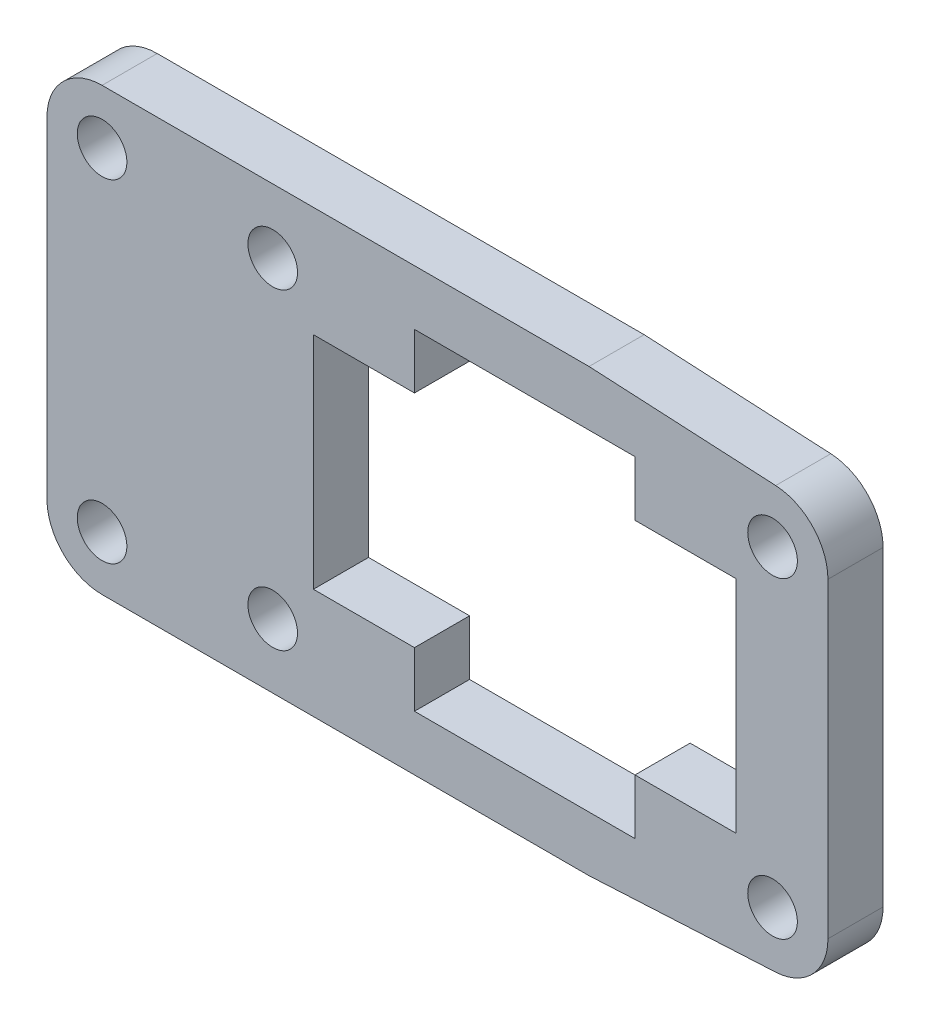
ISO-10303-21;
HEADER;
FILE_DESCRIPTION(('STEP AP214'),'2;1');
FILE_NAME('part.step','',(''),(''),'','','');
FILE_SCHEMA(('AUTOMOTIVE_DESIGN { 1 0 10303 214 1 1 1 1 }'));
ENDSEC;
DATA;
#1=APPLICATION_CONTEXT('core data for automotive mechanical design processes');
#2=APPLICATION_PROTOCOL_DEFINITION('international standard','automotive_design',2000,#1);
#3=PRODUCT_CONTEXT('',#1,'mechanical');
#4=PRODUCT('Part','Part','',(#3));
#5=PRODUCT_RELATED_PRODUCT_CATEGORY('part','',(#4));
#6=PRODUCT_DEFINITION_FORMATION('','',#4);
#7=PRODUCT_DEFINITION_CONTEXT('part definition',#1,'design');
#8=PRODUCT_DEFINITION('design','',#6,#7);
#9=PRODUCT_DEFINITION_SHAPE('','',#8);
#10=(LENGTH_UNIT() NAMED_UNIT(*) SI_UNIT(.MILLI.,.METRE.));
#11=(NAMED_UNIT(*) PLANE_ANGLE_UNIT() SI_UNIT($,.RADIAN.));
#12=(NAMED_UNIT(*) SI_UNIT($,.STERADIAN.) SOLID_ANGLE_UNIT());
#13=UNCERTAINTY_MEASURE_WITH_UNIT(LENGTH_MEASURE(1.E-05),#10,'distance_accuracy_value','');
#14=(GEOMETRIC_REPRESENTATION_CONTEXT(3) GLOBAL_UNCERTAINTY_ASSIGNED_CONTEXT((#13)) GLOBAL_UNIT_ASSIGNED_CONTEXT((#10,
#11,#12)) REPRESENTATION_CONTEXT('',''));
#15=CARTESIAN_POINT('',(0.,0.,0.));
#16=DIRECTION('',(0.,0.,1.));
#17=DIRECTION('',(1.,0.,0.));
#18=AXIS2_PLACEMENT_3D('',#15,#16,#17);
#19=CARTESIAN_POINT('',(-12.6573181561229,20.9998,0.));
#20=DIRECTION('',(0.,0.,1.));
#21=DIRECTION('',(1.,0.,0.));
#22=AXIS2_PLACEMENT_3D('',#19,#20,#21);
#23=CYLINDRICAL_SURFACE('',#22,2.99999999999999);
#24=CARTESIAN_POINT('',(-12.6573181561229,20.9998,3.));
#25=DIRECTION('',(0.,0.,1.));
#26=DIRECTION('',(1.,0.,0.));
#27=AXIS2_PLACEMENT_3D('',#24,#25,#26);
#28=CIRCLE('',#27,2.99999999999999);
#29=CARTESIAN_POINT('',(-12.6573181561229,23.9998,3.));
#30=VERTEX_POINT('',#29);
#31=CARTESIAN_POINT('',(-15.6573181561229,20.9998,3.));
#32=VERTEX_POINT('',#31);
#33=EDGE_CURVE('E319',#30,#32,#28,.T.);
#34=ORIENTED_EDGE('',*,*,#33,.F.);
#35=DIRECTION('',(0.,0.,1.));
#36=VECTOR('',#35,1.);
#37=CARTESIAN_POINT('',(-12.6573181561229,23.9998,0.));
#38=LINE('',#37,#36);
#39=CARTESIAN_POINT('',(-12.6573181561229,23.9998,0.));
#40=VERTEX_POINT('',#39);
#41=EDGE_CURVE('E11',#40,#30,#38,.T.);
#42=ORIENTED_EDGE('',*,*,#41,.F.);
#43=CARTESIAN_POINT('',(-12.6573181561229,20.9998,0.));
#44=DIRECTION('',(0.,0.,1.));
#45=DIRECTION('',(1.,0.,0.));
#46=AXIS2_PLACEMENT_3D('',#43,#44,#45);
#47=CIRCLE('',#46,2.99999999999999);
#48=CARTESIAN_POINT('',(-15.6573181561229,20.9998,0.));
#49=VERTEX_POINT('',#48);
#50=EDGE_CURVE('E322',#40,#49,#47,.T.);
#51=ORIENTED_EDGE('',*,*,#50,.T.);
#52=DIRECTION('',(0.,0.,1.));
#53=VECTOR('',#52,1.);
#54=CARTESIAN_POINT('',(-15.6573181561229,20.9998,0.));
#55=LINE('',#54,#53);
#56=EDGE_CURVE('E39',#49,#32,#55,.T.);
#57=ORIENTED_EDGE('',*,*,#56,.T.);
#58=EDGE_LOOP('',(#34,#42,#51,#57));
#59=FACE_BOUND('',#58,.T.);
#60=ADVANCED_FACE('F36',(#59),#23,.T.);
#61=CARTESIAN_POINT('',(13.8436818438771,23.9998,0.));
#62=DIRECTION('',(0.,1.,0.));
#63=DIRECTION('',(0.,0.,1.));
#64=AXIS2_PLACEMENT_3D('',#61,#62,#63);
#65=PLANE('',#64);
#66=DIRECTION('',(-1.,0.,0.));
#67=VECTOR('',#66,1.);
#68=CARTESIAN_POINT('',(13.8436818438771,23.9998,3.));
#69=LINE('',#68,#67);
#70=CARTESIAN_POINT('',(13.8436818438771,23.9998,3.));
#71=VERTEX_POINT('',#70);
#72=EDGE_CURVE('E326',#71,#30,#69,.T.);
#73=ORIENTED_EDGE('',*,*,#72,.F.);
#74=DIRECTION('',(0.,0.,1.));
#75=VECTOR('',#74,1.);
#76=CARTESIAN_POINT('',(13.8436818438771,23.9998,0.));
#77=LINE('',#76,#75);
#78=CARTESIAN_POINT('',(13.8436818438771,23.9998,0.));
#79=VERTEX_POINT('',#78);
#80=EDGE_CURVE('E44',#79,#71,#77,.T.);
#81=ORIENTED_EDGE('',*,*,#80,.F.);
#82=DIRECTION('',(-1.,0.,0.));
#83=VECTOR('',#82,1.);
#84=CARTESIAN_POINT('',(13.8436818438771,23.9998,0.));
#85=LINE('',#84,#83);
#86=EDGE_CURVE('E350',#79,#40,#85,.T.);
#87=ORIENTED_EDGE('',*,*,#86,.T.);
#88=ORIENTED_EDGE('',*,*,#41,.T.);
#89=EDGE_LOOP('',(#73,#81,#87,#88));
#90=FACE_BOUND('',#89,.T.);
#91=ADVANCED_FACE('F407',(#90),#65,.T.);
#92=CARTESIAN_POINT('',(24.0010920540107,23.4678047027526,0.));
#93=DIRECTION('',(0.0523034033778749,0.998631240245913,0.));
#94=DIRECTION('',(-0.998631240245914,0.0523034033778749,0.));
#95=AXIS2_PLACEMENT_3D('',#92,#93,#94);
#96=PLANE('',#95);
#97=DIRECTION('',(-0.998631240245914,0.0523034033778749,0.));
#98=VECTOR('',#97,1.);
#99=CARTESIAN_POINT('',(24.0010920540107,23.4678047027526,3.));
#100=LINE('',#99,#98);
#101=CARTESIAN_POINT('',(24.0010920540107,23.4678047027526,3.));
#102=VERTEX_POINT('',#101);
#103=EDGE_CURVE('E376',#102,#71,#100,.T.);
#104=ORIENTED_EDGE('',*,*,#103,.F.);
#105=DIRECTION('',(0.,0.,1.));
#106=VECTOR('',#105,1.);
#107=CARTESIAN_POINT('',(24.0010920540107,23.4678047027526,0.));
#108=LINE('',#107,#106);
#109=CARTESIAN_POINT('',(24.0010920540107,23.4678047027526,0.));
#110=VERTEX_POINT('',#109);
#111=EDGE_CURVE('E382',#110,#102,#108,.T.);
#112=ORIENTED_EDGE('',*,*,#111,.F.);
#113=DIRECTION('',(-0.998631240245914,0.0523034033778749,0.));
#114=VECTOR('',#113,1.);
#115=CARTESIAN_POINT('',(24.0010920540107,23.4678047027526,0.));
#116=LINE('',#115,#114);
#117=EDGE_CURVE('E347',#110,#79,#116,.T.);
#118=ORIENTED_EDGE('',*,*,#117,.T.);
#119=ORIENTED_EDGE('',*,*,#80,.T.);
#120=EDGE_LOOP('',(#104,#112,#118,#119));
#121=FACE_BOUND('',#120,.T.);
#122=ADVANCED_FACE('F435',(#121),#96,.T.);
#123=CARTESIAN_POINT('',(23.844181843877,20.4719109820149,0.));
#124=DIRECTION('',(0.,0.,1.));
#125=DIRECTION('',(1.,0.,0.));
#126=AXIS2_PLACEMENT_3D('',#123,#124,#125);
#127=CYLINDRICAL_SURFACE('',#126,3.00000000000001);
#128=CARTESIAN_POINT('',(23.844181843877,20.4719109820149,3.));
#129=DIRECTION('',(0.,0.,1.));
#130=DIRECTION('',(1.,0.,0.));
#131=AXIS2_PLACEMENT_3D('',#128,#129,#130);
#132=CIRCLE('',#131,3.00000000000001);
#133=CARTESIAN_POINT('',(26.844181843877,20.4719109820149,3.));
#134=VERTEX_POINT('',#133);
#135=EDGE_CURVE('E373',#134,#102,#132,.T.);
#136=ORIENTED_EDGE('',*,*,#135,.F.);
#137=DIRECTION('',(0.,0.,1.));
#138=VECTOR('',#137,1.);
#139=CARTESIAN_POINT('',(26.844181843877,20.4719109820149,0.));
#140=LINE('',#139,#138);
#141=CARTESIAN_POINT('',(26.844181843877,20.4719109820149,0.));
#142=VERTEX_POINT('',#141);
#143=EDGE_CURVE('E384',#142,#134,#140,.T.);
#144=ORIENTED_EDGE('',*,*,#143,.F.);
#145=CARTESIAN_POINT('',(23.844181843877,20.4719109820149,0.));
#146=DIRECTION('',(0.,0.,1.));
#147=DIRECTION('',(1.,0.,0.));
#148=AXIS2_PLACEMENT_3D('',#145,#146,#147);
#149=CIRCLE('',#148,3.00000000000001);
#150=EDGE_CURVE('E344',#142,#110,#149,.T.);
#151=ORIENTED_EDGE('',*,*,#150,.T.);
#152=ORIENTED_EDGE('',*,*,#111,.T.);
#153=EDGE_LOOP('',(#136,#144,#151,#152));
#154=FACE_BOUND('',#153,.T.);
#155=ADVANCED_FACE('F433',(#154),#127,.T.);
#156=CARTESIAN_POINT('',(26.844181843877,3.52888902362418,0.));
#157=DIRECTION('',(1.,0.,0.));
#158=DIRECTION('',(0.,0.,-1.));
#159=AXIS2_PLACEMENT_3D('',#156,#157,#158);
#160=PLANE('',#159);
#161=DIRECTION('',(0.,1.,0.));
#162=VECTOR('',#161,1.);
#163=CARTESIAN_POINT('',(26.844181843877,3.52888902362418,3.));
#164=LINE('',#163,#162);
#165=CARTESIAN_POINT('',(26.844181843877,3.52888902362418,3.));
#166=VERTEX_POINT('',#165);
#167=EDGE_CURVE('E370',#166,#134,#164,.T.);
#168=ORIENTED_EDGE('',*,*,#167,.F.);
#169=DIRECTION('',(0.,0.,1.));
#170=VECTOR('',#169,1.);
#171=CARTESIAN_POINT('',(26.844181843877,3.52888902362418,0.));
#172=LINE('',#171,#170);
#173=CARTESIAN_POINT('',(26.844181843877,3.52888902362418,0.));
#174=VERTEX_POINT('',#173);
#175=EDGE_CURVE('E386',#174,#166,#172,.T.);
#176=ORIENTED_EDGE('',*,*,#175,.F.);
#177=DIRECTION('',(0.,1.,0.));
#178=VECTOR('',#177,1.);
#179=CARTESIAN_POINT('',(26.844181843877,3.52888902362418,0.));
#180=LINE('',#179,#178);
#181=EDGE_CURVE('E341',#174,#142,#180,.T.);
#182=ORIENTED_EDGE('',*,*,#181,.T.);
#183=ORIENTED_EDGE('',*,*,#143,.T.);
#184=EDGE_LOOP('',(#168,#176,#182,#183));
#185=FACE_BOUND('',#184,.T.);
#186=ADVANCED_FACE('F429',(#185),#160,.T.);
#187=CARTESIAN_POINT('',(23.844181843877,3.52888902362418,0.));
#188=DIRECTION('',(0.,0.,1.));
#189=DIRECTION('',(1.,0.,0.));
#190=AXIS2_PLACEMENT_3D('',#187,#188,#189);
#191=CYLINDRICAL_SURFACE('',#190,3.);
#192=CARTESIAN_POINT('',(23.844181843877,3.52888902362418,3.));
#193=DIRECTION('',(0.,0.,1.));
#194=DIRECTION('',(1.,0.,0.));
#195=AXIS2_PLACEMENT_3D('',#192,#193,#194);
#196=CIRCLE('',#195,3.);
#197=CARTESIAN_POINT('',(24.0013861888822,0.533010722706152,3.));
#198=VERTEX_POINT('',#197);
#199=EDGE_CURVE('E367',#198,#166,#196,.T.);
#200=ORIENTED_EDGE('',*,*,#199,.F.);
#201=DIRECTION('',(0.,0.,1.));
#202=VECTOR('',#201,1.);
#203=CARTESIAN_POINT('',(24.0013861888822,0.533010722706152,0.));
#204=LINE('',#203,#202);
#205=CARTESIAN_POINT('',(24.0013861888822,0.533010722706152,0.));
#206=VERTEX_POINT('',#205);
#207=EDGE_CURVE('E388',#206,#198,#204,.T.);
#208=ORIENTED_EDGE('',*,*,#207,.F.);
#209=CARTESIAN_POINT('',(23.844181843877,3.52888902362418,0.));
#210=DIRECTION('',(0.,0.,1.));
#211=DIRECTION('',(1.,0.,0.));
#212=AXIS2_PLACEMENT_3D('',#209,#210,#211);
#213=CIRCLE('',#212,3.);
#214=EDGE_CURVE('E338',#206,#174,#213,.T.);
#215=ORIENTED_EDGE('',*,*,#214,.T.);
#216=ORIENTED_EDGE('',*,*,#175,.T.);
#217=EDGE_LOOP('',(#200,#208,#215,#216));
#218=FACE_BOUND('',#217,.T.);
#219=ADVANCED_FACE('F425',(#218),#191,.T.);
#220=CARTESIAN_POINT('',(13.8436818438771,0.,0.));
#221=DIRECTION('',(0.0524014483350333,-0.998626100306011,0.));
#222=DIRECTION('',(0.998626100306011,0.0524014483350333,0.));
#223=AXIS2_PLACEMENT_3D('',#220,#221,#222);
#224=PLANE('',#223);
#225=DIRECTION('',(0.998626100306011,0.0524014483350333,0.));
#226=VECTOR('',#225,1.);
#227=CARTESIAN_POINT('',(13.8436818438771,0.,3.));
#228=LINE('',#227,#226);
#229=CARTESIAN_POINT('',(13.8436818438771,0.,3.));
#230=VERTEX_POINT('',#229);
#231=EDGE_CURVE('E364',#230,#198,#228,.T.);
#232=ORIENTED_EDGE('',*,*,#231,.F.);
#233=DIRECTION('',(0.,0.,1.));
#234=VECTOR('',#233,1.);
#235=CARTESIAN_POINT('',(13.8436818438771,0.,0.));
#236=LINE('',#235,#234);
#237=CARTESIAN_POINT('',(13.8436818438771,0.,0.));
#238=VERTEX_POINT('',#237);
#239=EDGE_CURVE('E390',#238,#230,#236,.T.);
#240=ORIENTED_EDGE('',*,*,#239,.F.);
#241=DIRECTION('',(0.998626100306011,0.0524014483350333,0.));
#242=VECTOR('',#241,1.);
#243=CARTESIAN_POINT('',(13.8436818438771,0.,0.));
#244=LINE('',#243,#242);
#245=EDGE_CURVE('E335',#238,#206,#244,.T.);
#246=ORIENTED_EDGE('',*,*,#245,.T.);
#247=ORIENTED_EDGE('',*,*,#207,.T.);
#248=EDGE_LOOP('',(#232,#240,#246,#247));
#249=FACE_BOUND('',#248,.T.);
#250=ADVANCED_FACE('F421',(#249),#224,.T.);
#251=CARTESIAN_POINT('',(-12.6573181561229,0.,0.));
#252=DIRECTION('',(0.,-1.,0.));
#253=DIRECTION('',(1.,0.,0.));
#254=AXIS2_PLACEMENT_3D('',#251,#252,#253);
#255=PLANE('',#254);
#256=DIRECTION('',(1.,0.,0.));
#257=VECTOR('',#256,1.);
#258=CARTESIAN_POINT('',(-12.6573181561229,0.,3.));
#259=LINE('',#258,#257);
#260=CARTESIAN_POINT('',(-12.6573181561229,0.,3.));
#261=VERTEX_POINT('',#260);
#262=EDGE_CURVE('E361',#261,#230,#259,.T.);
#263=ORIENTED_EDGE('',*,*,#262,.F.);
#264=DIRECTION('',(0.,0.,1.));
#265=VECTOR('',#264,1.);
#266=CARTESIAN_POINT('',(-12.6573181561229,0.,0.));
#267=LINE('',#266,#265);
#268=CARTESIAN_POINT('',(-12.6573181561229,0.,0.));
#269=VERTEX_POINT('',#268);
#270=EDGE_CURVE('E392',#269,#261,#267,.T.);
#271=ORIENTED_EDGE('',*,*,#270,.F.);
#272=DIRECTION('',(1.,0.,0.));
#273=VECTOR('',#272,1.);
#274=CARTESIAN_POINT('',(-12.6573181561229,0.,0.));
#275=LINE('',#274,#273);
#276=EDGE_CURVE('E332',#269,#238,#275,.T.);
#277=ORIENTED_EDGE('',*,*,#276,.T.);
#278=ORIENTED_EDGE('',*,*,#239,.T.);
#279=EDGE_LOOP('',(#263,#271,#277,#278));
#280=FACE_BOUND('',#279,.T.);
#281=ADVANCED_FACE('F419',(#280),#255,.T.);
#282=CARTESIAN_POINT('',(-12.6573181561229,3.,0.));
#283=DIRECTION('',(0.,0.,1.));
#284=DIRECTION('',(1.,0.,0.));
#285=AXIS2_PLACEMENT_3D('',#282,#283,#284);
#286=CYLINDRICAL_SURFACE('',#285,2.99999999999999);
#287=CARTESIAN_POINT('',(-12.6573181561229,3.,3.));
#288=DIRECTION('',(0.,0.,1.));
#289=DIRECTION('',(1.,0.,0.));
#290=AXIS2_PLACEMENT_3D('',#287,#288,#289);
#291=CIRCLE('',#290,2.99999999999999);
#292=CARTESIAN_POINT('',(-15.6573181561229,3.,3.));
#293=VERTEX_POINT('',#292);
#294=EDGE_CURVE('E358',#293,#261,#291,.T.);
#295=ORIENTED_EDGE('',*,*,#294,.F.);
#296=DIRECTION('',(0.,0.,1.));
#297=VECTOR('',#296,1.);
#298=CARTESIAN_POINT('',(-15.6573181561229,3.,0.));
#299=LINE('',#298,#297);
#300=CARTESIAN_POINT('',(-15.6573181561229,3.,0.));
#301=VERTEX_POINT('',#300);
#302=EDGE_CURVE('E393',#301,#293,#299,.T.);
#303=ORIENTED_EDGE('',*,*,#302,.F.);
#304=CARTESIAN_POINT('',(-12.6573181561229,3.,0.));
#305=DIRECTION('',(0.,0.,1.));
#306=DIRECTION('',(1.,0.,0.));
#307=AXIS2_PLACEMENT_3D('',#304,#305,#306);
#308=CIRCLE('',#307,2.99999999999999);
#309=EDGE_CURVE('E329',#301,#269,#308,.T.);
#310=ORIENTED_EDGE('',*,*,#309,.T.);
#311=ORIENTED_EDGE('',*,*,#270,.T.);
#312=EDGE_LOOP('',(#295,#303,#310,#311));
#313=FACE_BOUND('',#312,.T.);
#314=ADVANCED_FACE('F415',(#313),#286,.T.);
#315=CARTESIAN_POINT('',(-15.6573181561229,20.9998,0.));
#316=DIRECTION('',(-1.,0.,0.));
#317=DIRECTION('',(0.,0.,1.));
#318=AXIS2_PLACEMENT_3D('',#315,#316,#317);
#319=PLANE('',#318);
#320=DIRECTION('',(0.,-1.,0.));
#321=VECTOR('',#320,1.);
#322=CARTESIAN_POINT('',(-15.6573181561229,20.9998,3.));
#323=LINE('',#322,#321);
#324=EDGE_CURVE('E355',#32,#293,#323,.T.);
#325=ORIENTED_EDGE('',*,*,#324,.F.);
#326=ORIENTED_EDGE('',*,*,#56,.F.);
#327=DIRECTION('',(0.,-1.,0.));
#328=VECTOR('',#327,1.);
#329=CARTESIAN_POINT('',(-15.6573181561229,20.9998,0.));
#330=LINE('',#329,#328);
#331=EDGE_CURVE('E325',#49,#301,#330,.T.);
#332=ORIENTED_EDGE('',*,*,#331,.T.);
#333=ORIENTED_EDGE('',*,*,#302,.T.);
#334=EDGE_LOOP('',(#325,#326,#332,#333));
#335=FACE_BOUND('',#334,.T.);
#336=ADVANCED_FACE('F401',(#335),#319,.T.);
#337=CARTESIAN_POINT('',(-12.6573181561229,20.9998,0.));
#338=DIRECTION('',(0.,0.,1.));
#339=DIRECTION('',(1.,0.,0.));
#340=AXIS2_PLACEMENT_3D('',#337,#338,#339);
#341=PLANE('',#340);
#342=DIRECTION('',(0.,-1.,0.));
#343=VECTOR('',#342,1.);
#344=CARTESIAN_POINT('',(4.34338184387702,17.9998,0.));
#345=LINE('',#344,#343);
#346=CARTESIAN_POINT('',(4.34338184387702,20.9998,0.));
#347=VERTEX_POINT('',#346);
#348=CARTESIAN_POINT('',(4.34338184387702,17.9998,0.));
#349=VERTEX_POINT('',#348);
#350=EDGE_CURVE('E193',#347,#349,#345,.T.);
#351=ORIENTED_EDGE('',*,*,#350,.T.);
#352=DIRECTION('',(-1.,0.,0.));
#353=VECTOR('',#352,1.);
#354=CARTESIAN_POINT('',(-1.15651815612298,17.9998,0.));
#355=LINE('',#354,#353);
#356=CARTESIAN_POINT('',(-1.15651815612298,17.9998,0.));
#357=VERTEX_POINT('',#356);
#358=EDGE_CURVE('E187',#349,#357,#355,.T.);
#359=ORIENTED_EDGE('',*,*,#358,.T.);
#360=DIRECTION('',(0.,-1.,0.));
#361=VECTOR('',#360,1.);
#362=CARTESIAN_POINT('',(-1.15651815612298,6.,0.));
#363=LINE('',#362,#361);
#364=CARTESIAN_POINT('',(-1.15651815612298,6.,0.));
#365=VERTEX_POINT('',#364);
#366=EDGE_CURVE('E196',#357,#365,#363,.T.);
#367=ORIENTED_EDGE('',*,*,#366,.T.);
#368=DIRECTION('',(1.,0.,0.));
#369=VECTOR('',#368,1.);
#370=CARTESIAN_POINT('',(4.34338184387701,6.,0.));
#371=LINE('',#370,#369);
#372=CARTESIAN_POINT('',(4.34338184387701,6.,0.));
#373=VERTEX_POINT('',#372);
#374=EDGE_CURVE('E52',#365,#373,#371,.T.);
#375=ORIENTED_EDGE('',*,*,#374,.T.);
#376=DIRECTION('',(0.,-1.,0.));
#377=VECTOR('',#376,1.);
#378=CARTESIAN_POINT('',(4.34338184387701,3.,0.));
#379=LINE('',#378,#377);
#380=CARTESIAN_POINT('',(4.34338184387701,3.,0.));
#381=VERTEX_POINT('',#380);
#382=EDGE_CURVE('E211',#373,#381,#379,.T.);
#383=ORIENTED_EDGE('',*,*,#382,.T.);
#384=DIRECTION('',(1.,0.,0.));
#385=VECTOR('',#384,1.);
#386=CARTESIAN_POINT('',(16.3433818438771,3.,0.));
#387=LINE('',#386,#385);
#388=CARTESIAN_POINT('',(16.3433818438771,3.,0.));
#389=VERTEX_POINT('',#388);
#390=EDGE_CURVE('E214',#381,#389,#387,.T.);
#391=ORIENTED_EDGE('',*,*,#390,.T.);
#392=DIRECTION('',(0.,1.,0.));
#393=VECTOR('',#392,1.);
#394=CARTESIAN_POINT('',(16.3433818438771,6.,0.));
#395=LINE('',#394,#393);
#396=CARTESIAN_POINT('',(16.3433818438771,6.,0.));
#397=VERTEX_POINT('',#396);
#398=EDGE_CURVE('E217',#389,#397,#395,.T.);
#399=ORIENTED_EDGE('',*,*,#398,.T.);
#400=DIRECTION('',(1.,0.,0.));
#401=VECTOR('',#400,1.);
#402=CARTESIAN_POINT('',(21.843181843877,6.,0.));
#403=LINE('',#402,#401);
#404=CARTESIAN_POINT('',(21.843181843877,6.,0.));
#405=VERTEX_POINT('',#404);
#406=EDGE_CURVE('E220',#397,#405,#403,.T.);
#407=ORIENTED_EDGE('',*,*,#406,.T.);
#408=DIRECTION('',(0.,1.,0.));
#409=VECTOR('',#408,1.);
#410=CARTESIAN_POINT('',(21.843181843877,17.9998,0.));
#411=LINE('',#410,#409);
#412=CARTESIAN_POINT('',(21.843181843877,17.9998,0.));
#413=VERTEX_POINT('',#412);
#414=EDGE_CURVE('E223',#405,#413,#411,.T.);
#415=ORIENTED_EDGE('',*,*,#414,.T.);
#416=DIRECTION('',(-1.,0.,0.));
#417=VECTOR('',#416,1.);
#418=CARTESIAN_POINT('',(16.3433818438771,17.9998,0.));
#419=LINE('',#418,#417);
#420=CARTESIAN_POINT('',(16.3433818438771,17.9998,0.));
#421=VERTEX_POINT('',#420);
#422=EDGE_CURVE('E226',#413,#421,#419,.T.);
#423=ORIENTED_EDGE('',*,*,#422,.T.);
#424=DIRECTION('',(0.,1.,0.));
#425=VECTOR('',#424,1.);
#426=CARTESIAN_POINT('',(16.3433818438771,20.9998,0.));
#427=LINE('',#426,#425);
#428=CARTESIAN_POINT('',(16.3433818438771,20.9998,0.));
#429=VERTEX_POINT('',#428);
#430=EDGE_CURVE('E229',#421,#429,#427,.T.);
#431=ORIENTED_EDGE('',*,*,#430,.T.);
#432=DIRECTION('',(-1.,0.,0.));
#433=VECTOR('',#432,1.);
#434=CARTESIAN_POINT('',(4.34338184387702,20.9998,0.));
#435=LINE('',#434,#433);
#436=EDGE_CURVE('E232',#429,#347,#435,.T.);
#437=ORIENTED_EDGE('',*,*,#436,.T.);
#438=EDGE_LOOP('',(#351,#359,#367,#375,#383,#391,#399,#407,#415,#423,#431,#437));
#439=FACE_BOUND('',#438,.T.);
#440=CARTESIAN_POINT('',(-12.657468156123,2.95,0.));
#441=DIRECTION('',(0.,0.,1.));
#442=DIRECTION('',(-1.,0.,0.));
#443=AXIS2_PLACEMENT_3D('',#440,#441,#442);
#444=CIRCLE('',#443,1.35);
#445=CARTESIAN_POINT('',(-14.007468156123,2.95,0.));
#446=VERTEX_POINT('',#445);
#447=EDGE_CURVE('E286',#446,#446,#444,.T.);
#448=ORIENTED_EDGE('',*,*,#447,.T.);
#449=EDGE_LOOP('',(#448));
#450=FACE_BOUND('',#449,.T.);
#451=CARTESIAN_POINT('',(-12.6574681561229,21.049,0.));
#452=DIRECTION('',(0.,0.,1.));
#453=DIRECTION('',(-1.,0.,0.));
#454=AXIS2_PLACEMENT_3D('',#451,#452,#453);
#455=CIRCLE('',#454,1.35);
#456=CARTESIAN_POINT('',(-14.0074681561229,21.049,0.));
#457=VERTEX_POINT('',#456);
#458=EDGE_CURVE('E292',#457,#457,#455,.T.);
#459=ORIENTED_EDGE('',*,*,#458,.T.);
#460=EDGE_LOOP('',(#459));
#461=FACE_BOUND('',#460,.T.);
#462=CARTESIAN_POINT('',(23.8299808020897,20.4983516507146,0.));
#463=DIRECTION('',(0.,0.,1.));
#464=DIRECTION('',(-1.,0.,0.));
#465=AXIS2_PLACEMENT_3D('',#462,#463,#464);
#466=CIRCLE('',#465,1.35);
#467=CARTESIAN_POINT('',(22.4799808020897,20.4983516507146,0.));
#468=VERTEX_POINT('',#467);
#469=EDGE_CURVE('E298',#468,#468,#466,.T.);
#470=ORIENTED_EDGE('',*,*,#469,.T.);
#471=EDGE_LOOP('',(#470));
#472=FACE_BOUND('',#471,.T.);
#473=CARTESIAN_POINT('',(23.8299808020896,3.50114834928544,0.));
#474=DIRECTION('',(0.,0.,1.));
#475=DIRECTION('',(-1.,0.,0.));
#476=AXIS2_PLACEMENT_3D('',#473,#474,#475);
#477=CIRCLE('',#476,1.35);
#478=CARTESIAN_POINT('',(22.4799808020896,3.50114834928544,0.));
#479=VERTEX_POINT('',#478);
#480=EDGE_CURVE('E304',#479,#479,#477,.T.);
#481=ORIENTED_EDGE('',*,*,#480,.T.);
#482=EDGE_LOOP('',(#481));
#483=FACE_BOUND('',#482,.T.);
#484=CARTESIAN_POINT('',(-3.37006919791033,20.4983516507146,0.));
#485=DIRECTION('',(0.,0.,1.));
#486=DIRECTION('',(-1.,0.,0.));
#487=AXIS2_PLACEMENT_3D('',#484,#485,#486);
#488=CIRCLE('',#487,1.35);
#489=CARTESIAN_POINT('',(-4.72006919791033,20.4983516507146,0.));
#490=VERTEX_POINT('',#489);
#491=EDGE_CURVE('E310',#490,#490,#488,.T.);
#492=ORIENTED_EDGE('',*,*,#491,.T.);
#493=EDGE_LOOP('',(#492));
#494=FACE_BOUND('',#493,.T.);
#495=CARTESIAN_POINT('',(-3.37006919791036,3.50114834928544,0.));
#496=DIRECTION('',(0.,0.,1.));
#497=DIRECTION('',(-1.,0.,0.));
#498=AXIS2_PLACEMENT_3D('',#495,#496,#497);
#499=CIRCLE('',#498,1.35);
#500=CARTESIAN_POINT('',(-4.72006919791036,3.50114834928544,0.));
#501=VERTEX_POINT('',#500);
#502=EDGE_CURVE('E316',#501,#501,#499,.T.);
#503=ORIENTED_EDGE('',*,*,#502,.T.);
#504=EDGE_LOOP('',(#503));
#505=FACE_BOUND('',#504,.T.);
#506=ORIENTED_EDGE('',*,*,#50,.F.);
#507=ORIENTED_EDGE('',*,*,#86,.F.);
#508=ORIENTED_EDGE('',*,*,#117,.F.);
#509=ORIENTED_EDGE('',*,*,#150,.F.);
#510=ORIENTED_EDGE('',*,*,#181,.F.);
#511=ORIENTED_EDGE('',*,*,#214,.F.);
#512=ORIENTED_EDGE('',*,*,#245,.F.);
#513=ORIENTED_EDGE('',*,*,#276,.F.);
#514=ORIENTED_EDGE('',*,*,#309,.F.);
#515=ORIENTED_EDGE('',*,*,#331,.F.);
#516=EDGE_LOOP('',(#506,#507,#508,#509,#510,#511,#512,#513,#514,#515));
#517=FACE_BOUND('',#516,.T.);
#518=ADVANCED_FACE('F200',(#439,#450,#461,#472,#483,#494,#505,#517),#341,.F.);
#519=CARTESIAN_POINT('',(-12.6573181561229,20.9998,3.));
#520=DIRECTION('',(0.,0.,1.));
#521=DIRECTION('',(1.,0.,0.));
#522=AXIS2_PLACEMENT_3D('',#519,#520,#521);
#523=PLANE('',#522);
#524=DIRECTION('',(-1.,0.,0.));
#525=VECTOR('',#524,1.);
#526=CARTESIAN_POINT('',(-1.15651815612298,17.9998,3.));
#527=LINE('',#526,#525);
#528=CARTESIAN_POINT('',(4.34338184387702,17.9998,3.));
#529=VERTEX_POINT('',#528);
#530=CARTESIAN_POINT('',(-1.15651815612298,17.9998,3.));
#531=VERTEX_POINT('',#530);
#532=EDGE_CURVE('E60',#529,#531,#527,.T.);
#533=ORIENTED_EDGE('',*,*,#532,.F.);
#534=DIRECTION('',(0.,-1.,0.));
#535=VECTOR('',#534,1.);
#536=CARTESIAN_POINT('',(4.34338184387702,17.9998,3.));
#537=LINE('',#536,#535);
#538=CARTESIAN_POINT('',(4.34338184387702,20.9998,3.));
#539=VERTEX_POINT('',#538);
#540=EDGE_CURVE('E204',#539,#529,#537,.T.);
#541=ORIENTED_EDGE('',*,*,#540,.F.);
#542=DIRECTION('',(-1.,0.,0.));
#543=VECTOR('',#542,1.);
#544=CARTESIAN_POINT('',(4.34338184387702,20.9998,3.));
#545=LINE('',#544,#543);
#546=CARTESIAN_POINT('',(16.3433818438771,20.9998,3.));
#547=VERTEX_POINT('',#546);
#548=EDGE_CURVE('E207',#547,#539,#545,.T.);
#549=ORIENTED_EDGE('',*,*,#548,.F.);
#550=DIRECTION('',(0.,1.,0.));
#551=VECTOR('',#550,1.);
#552=CARTESIAN_POINT('',(16.3433818438771,20.9998,3.));
#553=LINE('',#552,#551);
#554=CARTESIAN_POINT('',(16.3433818438771,17.9998,3.));
#555=VERTEX_POINT('',#554);
#556=EDGE_CURVE('E259',#555,#547,#553,.T.);
#557=ORIENTED_EDGE('',*,*,#556,.F.);
#558=DIRECTION('',(-1.,0.,0.));
#559=VECTOR('',#558,1.);
#560=CARTESIAN_POINT('',(16.3433818438771,17.9998,3.));
#561=LINE('',#560,#559);
#562=CARTESIAN_POINT('',(21.843181843877,17.9998,3.));
#563=VERTEX_POINT('',#562);
#564=EDGE_CURVE('E256',#563,#555,#561,.T.);
#565=ORIENTED_EDGE('',*,*,#564,.F.);
#566=DIRECTION('',(0.,1.,0.));
#567=VECTOR('',#566,1.);
#568=CARTESIAN_POINT('',(21.843181843877,17.9998,3.));
#569=LINE('',#568,#567);
#570=CARTESIAN_POINT('',(21.843181843877,6.,3.));
#571=VERTEX_POINT('',#570);
#572=EDGE_CURVE('E253',#571,#563,#569,.T.);
#573=ORIENTED_EDGE('',*,*,#572,.F.);
#574=DIRECTION('',(1.,0.,0.));
#575=VECTOR('',#574,1.);
#576=CARTESIAN_POINT('',(21.843181843877,6.,3.));
#577=LINE('',#576,#575);
#578=CARTESIAN_POINT('',(16.3433818438771,6.,3.));
#579=VERTEX_POINT('',#578);
#580=EDGE_CURVE('E250',#579,#571,#577,.T.);
#581=ORIENTED_EDGE('',*,*,#580,.F.);
#582=DIRECTION('',(0.,1.,0.));
#583=VECTOR('',#582,1.);
#584=CARTESIAN_POINT('',(16.3433818438771,6.,3.));
#585=LINE('',#584,#583);
#586=CARTESIAN_POINT('',(16.3433818438771,3.,3.));
#587=VERTEX_POINT('',#586);
#588=EDGE_CURVE('E247',#587,#579,#585,.T.);
#589=ORIENTED_EDGE('',*,*,#588,.F.);
#590=DIRECTION('',(1.,0.,0.));
#591=VECTOR('',#590,1.);
#592=CARTESIAN_POINT('',(16.3433818438771,3.,3.));
#593=LINE('',#592,#591);
#594=CARTESIAN_POINT('',(4.34338184387701,3.,3.));
#595=VERTEX_POINT('',#594);
#596=EDGE_CURVE('E244',#595,#587,#593,.T.);
#597=ORIENTED_EDGE('',*,*,#596,.F.);
#598=DIRECTION('',(0.,-1.,0.));
#599=VECTOR('',#598,1.);
#600=CARTESIAN_POINT('',(4.34338184387701,3.,3.));
#601=LINE('',#600,#599);
#602=CARTESIAN_POINT('',(4.34338184387701,6.,3.));
#603=VERTEX_POINT('',#602);
#604=EDGE_CURVE('E241',#603,#595,#601,.T.);
#605=ORIENTED_EDGE('',*,*,#604,.F.);
#606=DIRECTION('',(1.,0.,0.));
#607=VECTOR('',#606,1.);
#608=CARTESIAN_POINT('',(4.34338184387701,6.,3.));
#609=LINE('',#608,#607);
#610=CARTESIAN_POINT('',(-1.15651815612298,6.,3.));
#611=VERTEX_POINT('',#610);
#612=EDGE_CURVE('E238',#611,#603,#609,.T.);
#613=ORIENTED_EDGE('',*,*,#612,.F.);
#614=DIRECTION('',(0.,-1.,0.));
#615=VECTOR('',#614,1.);
#616=CARTESIAN_POINT('',(-1.15651815612298,6.,3.));
#617=LINE('',#616,#615);
#618=EDGE_CURVE('E236',#531,#611,#617,.T.);
#619=ORIENTED_EDGE('',*,*,#618,.F.);
#620=EDGE_LOOP('',(#533,#541,#549,#557,#565,#573,#581,#589,#597,#605,#613,#619));
#621=FACE_BOUND('',#620,.T.);
#622=CARTESIAN_POINT('',(-12.657468156123,2.95,3.));
#623=DIRECTION('',(0.,0.,1.));
#624=DIRECTION('',(-1.,0.,0.));
#625=AXIS2_PLACEMENT_3D('',#622,#623,#624);
#626=CIRCLE('',#625,1.35);
#627=CARTESIAN_POINT('',(-14.007468156123,2.95,3.));
#628=VERTEX_POINT('',#627);
#629=EDGE_CURVE('E266',#628,#628,#626,.T.);
#630=ORIENTED_EDGE('',*,*,#629,.F.);
#631=EDGE_LOOP('',(#630));
#632=FACE_BOUND('',#631,.T.);
#633=CARTESIAN_POINT('',(-12.6574681561229,21.049,3.));
#634=DIRECTION('',(0.,0.,1.));
#635=DIRECTION('',(-1.,0.,0.));
#636=AXIS2_PLACEMENT_3D('',#633,#634,#635);
#637=CIRCLE('',#636,1.35);
#638=CARTESIAN_POINT('',(-14.0074681561229,21.049,3.));
#639=VERTEX_POINT('',#638);
#640=EDGE_CURVE('E289',#639,#639,#637,.T.);
#641=ORIENTED_EDGE('',*,*,#640,.F.);
#642=EDGE_LOOP('',(#641));
#643=FACE_BOUND('',#642,.T.);
#644=CARTESIAN_POINT('',(23.8299808020897,20.4983516507146,3.));
#645=DIRECTION('',(0.,0.,1.));
#646=DIRECTION('',(-1.,0.,0.));
#647=AXIS2_PLACEMENT_3D('',#644,#645,#646);
#648=CIRCLE('',#647,1.35);
#649=CARTESIAN_POINT('',(22.4799808020897,20.4983516507146,3.));
#650=VERTEX_POINT('',#649);
#651=EDGE_CURVE('E295',#650,#650,#648,.T.);
#652=ORIENTED_EDGE('',*,*,#651,.F.);
#653=EDGE_LOOP('',(#652));
#654=FACE_BOUND('',#653,.T.);
#655=CARTESIAN_POINT('',(23.8299808020896,3.50114834928544,3.));
#656=DIRECTION('',(0.,0.,1.));
#657=DIRECTION('',(-1.,0.,0.));
#658=AXIS2_PLACEMENT_3D('',#655,#656,#657);
#659=CIRCLE('',#658,1.35);
#660=CARTESIAN_POINT('',(22.4799808020896,3.50114834928544,3.));
#661=VERTEX_POINT('',#660);
#662=EDGE_CURVE('E301',#661,#661,#659,.T.);
#663=ORIENTED_EDGE('',*,*,#662,.F.);
#664=EDGE_LOOP('',(#663));
#665=FACE_BOUND('',#664,.T.);
#666=CARTESIAN_POINT('',(-3.37006919791033,20.4983516507146,3.));
#667=DIRECTION('',(0.,0.,1.));
#668=DIRECTION('',(-1.,0.,0.));
#669=AXIS2_PLACEMENT_3D('',#666,#667,#668);
#670=CIRCLE('',#669,1.35);
#671=CARTESIAN_POINT('',(-4.72006919791033,20.4983516507146,3.));
#672=VERTEX_POINT('',#671);
#673=EDGE_CURVE('E307',#672,#672,#670,.T.);
#674=ORIENTED_EDGE('',*,*,#673,.F.);
#675=EDGE_LOOP('',(#674));
#676=FACE_BOUND('',#675,.T.);
#677=CARTESIAN_POINT('',(-3.37006919791036,3.50114834928544,3.));
#678=DIRECTION('',(0.,0.,1.));
#679=DIRECTION('',(-1.,0.,0.));
#680=AXIS2_PLACEMENT_3D('',#677,#678,#679);
#681=CIRCLE('',#680,1.35);
#682=CARTESIAN_POINT('',(-4.72006919791036,3.50114834928544,3.));
#683=VERTEX_POINT('',#682);
#684=EDGE_CURVE('E313',#683,#683,#681,.T.);
#685=ORIENTED_EDGE('',*,*,#684,.F.);
#686=EDGE_LOOP('',(#685));
#687=FACE_BOUND('',#686,.T.);
#688=ORIENTED_EDGE('',*,*,#33,.T.);
#689=ORIENTED_EDGE('',*,*,#324,.T.);
#690=ORIENTED_EDGE('',*,*,#294,.T.);
#691=ORIENTED_EDGE('',*,*,#262,.T.);
#692=ORIENTED_EDGE('',*,*,#231,.T.);
#693=ORIENTED_EDGE('',*,*,#199,.T.);
#694=ORIENTED_EDGE('',*,*,#167,.T.);
#695=ORIENTED_EDGE('',*,*,#135,.T.);
#696=ORIENTED_EDGE('',*,*,#103,.T.);
#697=ORIENTED_EDGE('',*,*,#72,.T.);
#698=EDGE_LOOP('',(#688,#689,#690,#691,#692,#693,#694,#695,#696,#697));
#699=FACE_BOUND('',#698,.T.);
#700=ADVANCED_FACE('F403',(#621,#632,#643,#654,#665,#676,#687,#699),#523,.T.);
#701=CARTESIAN_POINT('',(-3.37006919791036,3.50114834928544,0.));
#702=DIRECTION('',(0.,0.,1.));
#703=DIRECTION('',(1.,0.,0.));
#704=AXIS2_PLACEMENT_3D('',#701,#702,#703);
#705=CYLINDRICAL_SURFACE('',#704,1.35);
#706=ORIENTED_EDGE('',*,*,#502,.F.);
#707=EDGE_LOOP('',(#706));
#708=FACE_BOUND('',#707,.T.);
#709=ORIENTED_EDGE('',*,*,#684,.T.);
#710=EDGE_LOOP('',(#709));
#711=FACE_BOUND('',#710,.T.);
#712=ADVANCED_FACE('F525',(#708,#711),#705,.F.);
#713=CARTESIAN_POINT('',(-3.37006919791033,20.4983516507146,0.));
#714=DIRECTION('',(0.,0.,1.));
#715=DIRECTION('',(1.,0.,0.));
#716=AXIS2_PLACEMENT_3D('',#713,#714,#715);
#717=CYLINDRICAL_SURFACE('',#716,1.35);
#718=ORIENTED_EDGE('',*,*,#491,.F.);
#719=EDGE_LOOP('',(#718));
#720=FACE_BOUND('',#719,.T.);
#721=ORIENTED_EDGE('',*,*,#673,.T.);
#722=EDGE_LOOP('',(#721));
#723=FACE_BOUND('',#722,.T.);
#724=ADVANCED_FACE('F535',(#720,#723),#717,.F.);
#725=CARTESIAN_POINT('',(23.8299808020896,3.50114834928544,0.));
#726=DIRECTION('',(0.,0.,1.));
#727=DIRECTION('',(1.,0.,0.));
#728=AXIS2_PLACEMENT_3D('',#725,#726,#727);
#729=CYLINDRICAL_SURFACE('',#728,1.35);
#730=ORIENTED_EDGE('',*,*,#480,.F.);
#731=EDGE_LOOP('',(#730));
#732=FACE_BOUND('',#731,.T.);
#733=ORIENTED_EDGE('',*,*,#662,.T.);
#734=EDGE_LOOP('',(#733));
#735=FACE_BOUND('',#734,.T.);
#736=ADVANCED_FACE('F545',(#732,#735),#729,.F.);
#737=CARTESIAN_POINT('',(23.8299808020897,20.4983516507146,0.));
#738=DIRECTION('',(0.,0.,1.));
#739=DIRECTION('',(1.,0.,0.));
#740=AXIS2_PLACEMENT_3D('',#737,#738,#739);
#741=CYLINDRICAL_SURFACE('',#740,1.35);
#742=ORIENTED_EDGE('',*,*,#469,.F.);
#743=EDGE_LOOP('',(#742));
#744=FACE_BOUND('',#743,.T.);
#745=ORIENTED_EDGE('',*,*,#651,.T.);
#746=EDGE_LOOP('',(#745));
#747=FACE_BOUND('',#746,.T.);
#748=ADVANCED_FACE('F555',(#744,#747),#741,.F.);
#749=CARTESIAN_POINT('',(-12.6574681561229,21.049,0.));
#750=DIRECTION('',(0.,0.,1.));
#751=DIRECTION('',(1.,0.,0.));
#752=AXIS2_PLACEMENT_3D('',#749,#750,#751);
#753=CYLINDRICAL_SURFACE('',#752,1.35);
#754=ORIENTED_EDGE('',*,*,#458,.F.);
#755=EDGE_LOOP('',(#754));
#756=FACE_BOUND('',#755,.T.);
#757=ORIENTED_EDGE('',*,*,#640,.T.);
#758=EDGE_LOOP('',(#757));
#759=FACE_BOUND('',#758,.T.);
#760=ADVANCED_FACE('F565',(#756,#759),#753,.F.);
#761=CARTESIAN_POINT('',(-12.657468156123,2.95,0.));
#762=DIRECTION('',(0.,0.,1.));
#763=DIRECTION('',(1.,0.,0.));
#764=AXIS2_PLACEMENT_3D('',#761,#762,#763);
#765=CYLINDRICAL_SURFACE('',#764,1.35);
#766=ORIENTED_EDGE('',*,*,#447,.F.);
#767=EDGE_LOOP('',(#766));
#768=FACE_BOUND('',#767,.T.);
#769=ORIENTED_EDGE('',*,*,#629,.T.);
#770=EDGE_LOOP('',(#769));
#771=FACE_BOUND('',#770,.T.);
#772=ADVANCED_FACE('F575',(#768,#771),#765,.F.);
#773=CARTESIAN_POINT('',(-1.15651815612298,17.9998,0.));
#774=DIRECTION('',(0.,1.,0.));
#775=DIRECTION('',(0.,0.,1.));
#776=AXIS2_PLACEMENT_3D('',#773,#774,#775);
#777=PLANE('',#776);
#778=ORIENTED_EDGE('',*,*,#532,.T.);
#779=DIRECTION('',(0.,0.,1.));
#780=VECTOR('',#779,1.);
#781=CARTESIAN_POINT('',(-1.15651815612298,17.9998,0.));
#782=LINE('',#781,#780);
#783=EDGE_CURVE('E183',#357,#531,#782,.T.);
#784=ORIENTED_EDGE('',*,*,#783,.F.);
#785=ORIENTED_EDGE('',*,*,#358,.F.);
#786=DIRECTION('',(0.,0.,1.));
#787=VECTOR('',#786,1.);
#788=CARTESIAN_POINT('',(4.34338184387702,17.9998,0.));
#789=LINE('',#788,#787);
#790=EDGE_CURVE('E264',#349,#529,#789,.T.);
#791=ORIENTED_EDGE('',*,*,#790,.T.);
#792=EDGE_LOOP('',(#778,#784,#785,#791));
#793=FACE_BOUND('',#792,.T.);
#794=ADVANCED_FACE('F185',(#793),#777,.F.);
#795=CARTESIAN_POINT('',(4.34338184387702,17.9998,0.));
#796=DIRECTION('',(-1.,0.,0.));
#797=DIRECTION('',(0.,0.,1.));
#798=AXIS2_PLACEMENT_3D('',#795,#796,#797);
#799=PLANE('',#798);
#800=ORIENTED_EDGE('',*,*,#540,.T.);
#801=ORIENTED_EDGE('',*,*,#790,.F.);
#802=ORIENTED_EDGE('',*,*,#350,.F.);
#803=DIRECTION('',(0.,0.,1.));
#804=VECTOR('',#803,1.);
#805=CARTESIAN_POINT('',(4.34338184387702,20.9998,0.));
#806=LINE('',#805,#804);
#807=EDGE_CURVE('E267',#347,#539,#806,.T.);
#808=ORIENTED_EDGE('',*,*,#807,.T.);
#809=EDGE_LOOP('',(#800,#801,#802,#808));
#810=FACE_BOUND('',#809,.T.);
#811=ADVANCED_FACE('F594',(#810),#799,.F.);
#812=CARTESIAN_POINT('',(4.34338184387702,20.9998,0.));
#813=DIRECTION('',(0.,1.,0.));
#814=DIRECTION('',(0.,0.,1.));
#815=AXIS2_PLACEMENT_3D('',#812,#813,#814);
#816=PLANE('',#815);
#817=ORIENTED_EDGE('',*,*,#548,.T.);
#818=ORIENTED_EDGE('',*,*,#807,.F.);
#819=ORIENTED_EDGE('',*,*,#436,.F.);
#820=DIRECTION('',(0.,0.,1.));
#821=VECTOR('',#820,1.);
#822=CARTESIAN_POINT('',(16.3433818438771,20.9998,0.));
#823=LINE('',#822,#821);
#824=EDGE_CURVE('E269',#429,#547,#823,.T.);
#825=ORIENTED_EDGE('',*,*,#824,.T.);
#826=EDGE_LOOP('',(#817,#818,#819,#825));
#827=FACE_BOUND('',#826,.T.);
#828=ADVANCED_FACE('F603',(#827),#816,.F.);
#829=CARTESIAN_POINT('',(16.3433818438771,20.9998,0.));
#830=DIRECTION('',(1.,0.,0.));
#831=DIRECTION('',(0.,0.,-1.));
#832=AXIS2_PLACEMENT_3D('',#829,#830,#831);
#833=PLANE('',#832);
#834=ORIENTED_EDGE('',*,*,#556,.T.);
#835=ORIENTED_EDGE('',*,*,#824,.F.);
#836=ORIENTED_EDGE('',*,*,#430,.F.);
#837=DIRECTION('',(0.,0.,1.));
#838=VECTOR('',#837,1.);
#839=CARTESIAN_POINT('',(16.3433818438771,17.9998,0.));
#840=LINE('',#839,#838);
#841=EDGE_CURVE('E271',#421,#555,#840,.T.);
#842=ORIENTED_EDGE('',*,*,#841,.T.);
#843=EDGE_LOOP('',(#834,#835,#836,#842));
#844=FACE_BOUND('',#843,.T.);
#845=ADVANCED_FACE('F613',(#844),#833,.F.);
#846=CARTESIAN_POINT('',(16.3433818438771,17.9998,0.));
#847=DIRECTION('',(0.,1.,0.));
#848=DIRECTION('',(0.,0.,1.));
#849=AXIS2_PLACEMENT_3D('',#846,#847,#848);
#850=PLANE('',#849);
#851=ORIENTED_EDGE('',*,*,#564,.T.);
#852=ORIENTED_EDGE('',*,*,#841,.F.);
#853=ORIENTED_EDGE('',*,*,#422,.F.);
#854=DIRECTION('',(0.,0.,1.));
#855=VECTOR('',#854,1.);
#856=CARTESIAN_POINT('',(21.843181843877,17.9998,0.));
#857=LINE('',#856,#855);
#858=EDGE_CURVE('E273',#413,#563,#857,.T.);
#859=ORIENTED_EDGE('',*,*,#858,.T.);
#860=EDGE_LOOP('',(#851,#852,#853,#859));
#861=FACE_BOUND('',#860,.T.);
#862=ADVANCED_FACE('F623',(#861),#850,.F.);
#863=CARTESIAN_POINT('',(21.843181843877,17.9998,0.));
#864=DIRECTION('',(1.,0.,0.));
#865=DIRECTION('',(0.,0.,-1.));
#866=AXIS2_PLACEMENT_3D('',#863,#864,#865);
#867=PLANE('',#866);
#868=ORIENTED_EDGE('',*,*,#572,.T.);
#869=ORIENTED_EDGE('',*,*,#858,.F.);
#870=ORIENTED_EDGE('',*,*,#414,.F.);
#871=DIRECTION('',(0.,0.,1.));
#872=VECTOR('',#871,1.);
#873=CARTESIAN_POINT('',(21.843181843877,6.,0.));
#874=LINE('',#873,#872);
#875=EDGE_CURVE('E275',#405,#571,#874,.T.);
#876=ORIENTED_EDGE('',*,*,#875,.T.);
#877=EDGE_LOOP('',(#868,#869,#870,#876));
#878=FACE_BOUND('',#877,.T.);
#879=ADVANCED_FACE('F633',(#878),#867,.F.);
#880=CARTESIAN_POINT('',(21.843181843877,6.,0.));
#881=DIRECTION('',(0.,-1.,0.));
#882=DIRECTION('',(0.,0.,-1.));
#883=AXIS2_PLACEMENT_3D('',#880,#881,#882);
#884=PLANE('',#883);
#885=ORIENTED_EDGE('',*,*,#580,.T.);
#886=ORIENTED_EDGE('',*,*,#875,.F.);
#887=ORIENTED_EDGE('',*,*,#406,.F.);
#888=DIRECTION('',(0.,0.,1.));
#889=VECTOR('',#888,1.);
#890=CARTESIAN_POINT('',(16.3433818438771,6.,0.));
#891=LINE('',#890,#889);
#892=EDGE_CURVE('E277',#397,#579,#891,.T.);
#893=ORIENTED_EDGE('',*,*,#892,.T.);
#894=EDGE_LOOP('',(#885,#886,#887,#893));
#895=FACE_BOUND('',#894,.T.);
#896=ADVANCED_FACE('F643',(#895),#884,.F.);
#897=CARTESIAN_POINT('',(16.3433818438771,6.,0.));
#898=DIRECTION('',(1.,0.,0.));
#899=DIRECTION('',(0.,0.,-1.));
#900=AXIS2_PLACEMENT_3D('',#897,#898,#899);
#901=PLANE('',#900);
#902=ORIENTED_EDGE('',*,*,#588,.T.);
#903=ORIENTED_EDGE('',*,*,#892,.F.);
#904=ORIENTED_EDGE('',*,*,#398,.F.);
#905=DIRECTION('',(0.,0.,1.));
#906=VECTOR('',#905,1.);
#907=CARTESIAN_POINT('',(16.3433818438771,3.,0.));
#908=LINE('',#907,#906);
#909=EDGE_CURVE('E279',#389,#587,#908,.T.);
#910=ORIENTED_EDGE('',*,*,#909,.T.);
#911=EDGE_LOOP('',(#902,#903,#904,#910));
#912=FACE_BOUND('',#911,.T.);
#913=ADVANCED_FACE('F653',(#912),#901,.F.);
#914=CARTESIAN_POINT('',(16.3433818438771,3.,0.));
#915=DIRECTION('',(0.,-1.,0.));
#916=DIRECTION('',(0.,0.,-1.));
#917=AXIS2_PLACEMENT_3D('',#914,#915,#916);
#918=PLANE('',#917);
#919=ORIENTED_EDGE('',*,*,#596,.T.);
#920=ORIENTED_EDGE('',*,*,#909,.F.);
#921=ORIENTED_EDGE('',*,*,#390,.F.);
#922=DIRECTION('',(0.,0.,1.));
#923=VECTOR('',#922,1.);
#924=CARTESIAN_POINT('',(4.34338184387701,3.,0.));
#925=LINE('',#924,#923);
#926=EDGE_CURVE('E281',#381,#595,#925,.T.);
#927=ORIENTED_EDGE('',*,*,#926,.T.);
#928=EDGE_LOOP('',(#919,#920,#921,#927));
#929=FACE_BOUND('',#928,.T.);
#930=ADVANCED_FACE('F663',(#929),#918,.F.);
#931=CARTESIAN_POINT('',(4.34338184387701,3.,0.));
#932=DIRECTION('',(-1.,0.,0.));
#933=DIRECTION('',(0.,0.,1.));
#934=AXIS2_PLACEMENT_3D('',#931,#932,#933);
#935=PLANE('',#934);
#936=ORIENTED_EDGE('',*,*,#604,.T.);
#937=ORIENTED_EDGE('',*,*,#926,.F.);
#938=ORIENTED_EDGE('',*,*,#382,.F.);
#939=DIRECTION('',(0.,0.,1.));
#940=VECTOR('',#939,1.);
#941=CARTESIAN_POINT('',(4.34338184387701,6.,0.));
#942=LINE('',#941,#940);
#943=EDGE_CURVE('E283',#373,#603,#942,.T.);
#944=ORIENTED_EDGE('',*,*,#943,.T.);
#945=EDGE_LOOP('',(#936,#937,#938,#944));
#946=FACE_BOUND('',#945,.T.);
#947=ADVANCED_FACE('F673',(#946),#935,.F.);
#948=CARTESIAN_POINT('',(4.34338184387701,6.,0.));
#949=DIRECTION('',(0.,-1.,0.));
#950=DIRECTION('',(0.,0.,-1.));
#951=AXIS2_PLACEMENT_3D('',#948,#949,#950);
#952=PLANE('',#951);
#953=ORIENTED_EDGE('',*,*,#612,.T.);
#954=ORIENTED_EDGE('',*,*,#943,.F.);
#955=ORIENTED_EDGE('',*,*,#374,.F.);
#956=DIRECTION('',(0.,0.,1.));
#957=VECTOR('',#956,1.);
#958=CARTESIAN_POINT('',(-1.15651815612298,6.,0.));
#959=LINE('',#958,#957);
#960=EDGE_CURVE('E192',#365,#611,#959,.T.);
#961=ORIENTED_EDGE('',*,*,#960,.T.);
#962=EDGE_LOOP('',(#953,#954,#955,#961));
#963=FACE_BOUND('',#962,.T.);
#964=ADVANCED_FACE('F683',(#963),#952,.F.);
#965=CARTESIAN_POINT('',(-1.15651815612298,6.,0.));
#966=DIRECTION('',(-1.,0.,0.));
#967=DIRECTION('',(0.,0.,1.));
#968=AXIS2_PLACEMENT_3D('',#965,#966,#967);
#969=PLANE('',#968);
#970=ORIENTED_EDGE('',*,*,#618,.T.);
#971=ORIENTED_EDGE('',*,*,#960,.F.);
#972=ORIENTED_EDGE('',*,*,#366,.F.);
#973=ORIENTED_EDGE('',*,*,#783,.T.);
#974=EDGE_LOOP('',(#970,#971,#972,#973));
#975=FACE_BOUND('',#974,.T.);
#976=ADVANCED_FACE('F197',(#975),#969,.F.);
#977=CLOSED_SHELL('',(#60,#91,#122,#155,#186,#219,#250,#281,#314,#336,#518,#700,#712,#724,#736,
#748,#760,#772,#794,#811,#828,#845,#862,#879,#896,#913,#930,#947,#964,#976));
#978=MANIFOLD_SOLID_BREP('B2',#977);
#979=ADVANCED_BREP_SHAPE_REPRESENTATION('',(#18,#978),#14);
#980=SHAPE_DEFINITION_REPRESENTATION(#9,#979);
ENDSEC;
END-ISO-10303-21;
